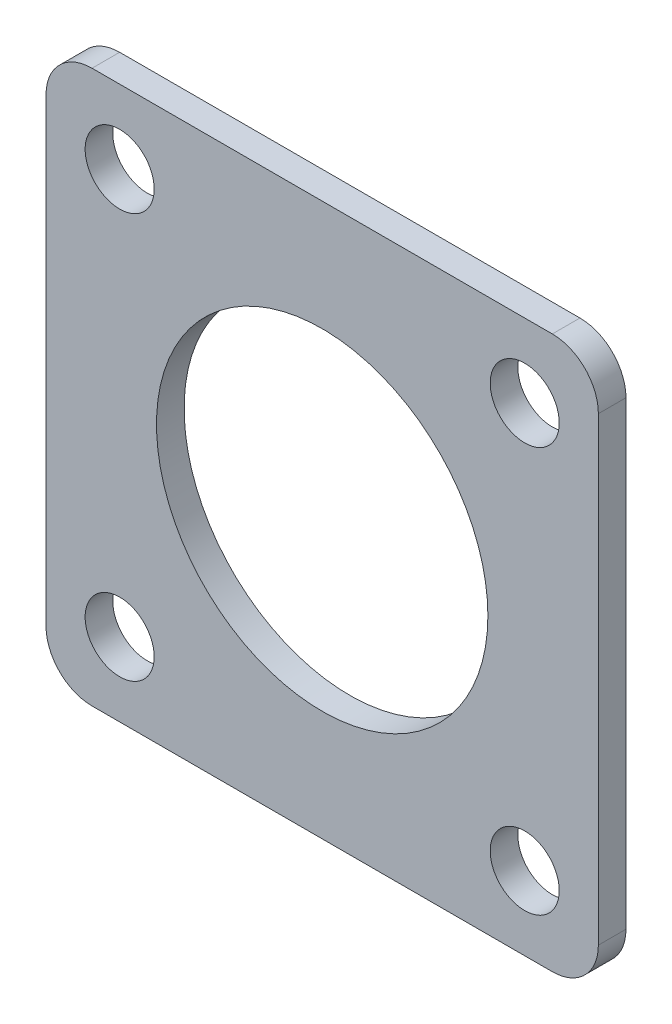
ISO-10303-21;
HEADER;
FILE_DESCRIPTION(('STEP AP214'),'2;1');
FILE_NAME('part.step','',(''),(''),'','','');
FILE_SCHEMA(('AUTOMOTIVE_DESIGN { 1 0 10303 214 1 1 1 1 }'));
ENDSEC;
DATA;
#1=APPLICATION_CONTEXT('core data for automotive mechanical design processes');
#2=APPLICATION_PROTOCOL_DEFINITION('international standard','automotive_design',2000,#1);
#3=PRODUCT_CONTEXT('',#1,'mechanical');
#4=PRODUCT('Part','Part','',(#3));
#5=PRODUCT_RELATED_PRODUCT_CATEGORY('part','',(#4));
#6=PRODUCT_DEFINITION_FORMATION('','',#4);
#7=PRODUCT_DEFINITION_CONTEXT('part definition',#1,'design');
#8=PRODUCT_DEFINITION('design','',#6,#7);
#9=PRODUCT_DEFINITION_SHAPE('','',#8);
#10=(LENGTH_UNIT() NAMED_UNIT(*) SI_UNIT(.MILLI.,.METRE.));
#11=(NAMED_UNIT(*) PLANE_ANGLE_UNIT() SI_UNIT($,.RADIAN.));
#12=(NAMED_UNIT(*) SI_UNIT($,.STERADIAN.) SOLID_ANGLE_UNIT());
#13=UNCERTAINTY_MEASURE_WITH_UNIT(LENGTH_MEASURE(1.E-05),#10,'distance_accuracy_value','');
#14=(GEOMETRIC_REPRESENTATION_CONTEXT(3) GLOBAL_UNCERTAINTY_ASSIGNED_CONTEXT((#13)) GLOBAL_UNIT_ASSIGNED_CONTEXT((#10,
#11,#12)) REPRESENTATION_CONTEXT('',''));
#15=CARTESIAN_POINT('',(0.,0.,0.));
#16=DIRECTION('',(0.,0.,1.));
#17=DIRECTION('',(1.,0.,0.));
#18=AXIS2_PLACEMENT_3D('',#15,#16,#17);
#19=CARTESIAN_POINT('',(0.,0.,0.));
#20=DIRECTION('',(0.,0.,1.));
#21=DIRECTION('',(1.,0.,0.));
#22=AXIS2_PLACEMENT_3D('',#19,#20,#21);
#23=PLANE('',#22);
#24=CARTESIAN_POINT('',(-2.2,2.2,0.));
#25=DIRECTION('',(0.,0.,1.));
#26=DIRECTION('',(1.,0.,0.));
#27=AXIS2_PLACEMENT_3D('',#24,#25,#26);
#28=CIRCLE('',#27,0.375);
#29=CARTESIAN_POINT('',(-1.825,2.2,0.));
#30=VERTEX_POINT('',#29);
#31=EDGE_CURVE('E143',#30,#30,#28,.T.);
#32=ORIENTED_EDGE('',*,*,#31,.T.);
#33=EDGE_LOOP('',(#32));
#34=FACE_BOUND('',#33,.T.);
#35=CARTESIAN_POINT('',(2.2,2.2,0.));
#36=DIRECTION('',(0.,0.,1.));
#37=DIRECTION('',(1.,0.,0.));
#38=AXIS2_PLACEMENT_3D('',#35,#36,#37);
#39=CIRCLE('',#38,0.375);
#40=CARTESIAN_POINT('',(2.575,2.2,0.));
#41=VERTEX_POINT('',#40);
#42=EDGE_CURVE('E146',#41,#41,#39,.T.);
#43=ORIENTED_EDGE('',*,*,#42,.T.);
#44=EDGE_LOOP('',(#43));
#45=FACE_BOUND('',#44,.T.);
#46=CARTESIAN_POINT('',(2.2,-2.2,0.));
#47=DIRECTION('',(0.,0.,1.));
#48=DIRECTION('',(1.,0.,0.));
#49=AXIS2_PLACEMENT_3D('',#46,#47,#48);
#50=CIRCLE('',#49,0.375);
#51=CARTESIAN_POINT('',(2.575,-2.2,0.));
#52=VERTEX_POINT('',#51);
#53=EDGE_CURVE('E149',#52,#52,#50,.T.);
#54=ORIENTED_EDGE('',*,*,#53,.T.);
#55=EDGE_LOOP('',(#54));
#56=FACE_BOUND('',#55,.T.);
#57=CARTESIAN_POINT('',(-2.2,-2.2,0.));
#58=DIRECTION('',(0.,0.,1.));
#59=DIRECTION('',(1.,0.,0.));
#60=AXIS2_PLACEMENT_3D('',#57,#58,#59);
#61=CIRCLE('',#60,0.375);
#62=CARTESIAN_POINT('',(-1.825,-2.2,0.));
#63=VERTEX_POINT('',#62);
#64=EDGE_CURVE('E102',#63,#63,#61,.T.);
#65=ORIENTED_EDGE('',*,*,#64,.T.);
#66=EDGE_LOOP('',(#65));
#67=FACE_BOUND('',#66,.T.);
#68=CARTESIAN_POINT('',(0.,0.,0.));
#69=DIRECTION('',(0.,0.,1.));
#70=DIRECTION('',(1.,0.,0.));
#71=AXIS2_PLACEMENT_3D('',#68,#69,#70);
#72=CIRCLE('',#71,1.8);
#73=CARTESIAN_POINT('',(1.8,0.,0.));
#74=VERTEX_POINT('',#73);
#75=EDGE_CURVE('E99',#74,#74,#72,.T.);
#76=ORIENTED_EDGE('',*,*,#75,.T.);
#77=EDGE_LOOP('',(#76));
#78=FACE_BOUND('',#77,.T.);
#79=DIRECTION('',(0.,1.,0.));
#80=VECTOR('',#79,1.);
#81=CARTESIAN_POINT('',(3.,3.,0.));
#82=LINE('',#81,#80);
#83=CARTESIAN_POINT('',(3.,-2.5,0.));
#84=VERTEX_POINT('',#83);
#85=CARTESIAN_POINT('',(3.,2.5,0.));
#86=VERTEX_POINT('',#85);
#87=EDGE_CURVE('E83',#84,#86,#82,.T.);
#88=ORIENTED_EDGE('',*,*,#87,.F.);
#89=CARTESIAN_POINT('',(2.5,-2.5,0.));
#90=DIRECTION('',(0.,0.,1.));
#91=DIRECTION('',(1.,0.,0.));
#92=AXIS2_PLACEMENT_3D('',#89,#90,#91);
#93=CIRCLE('',#92,0.5);
#94=CARTESIAN_POINT('',(2.5,-3.,0.));
#95=VERTEX_POINT('',#94);
#96=EDGE_CURVE('E96',#95,#84,#93,.T.);
#97=ORIENTED_EDGE('',*,*,#96,.F.);
#98=DIRECTION('',(1.,0.,0.));
#99=VECTOR('',#98,1.);
#100=CARTESIAN_POINT('',(3.,-3.,0.));
#101=LINE('',#100,#99);
#102=CARTESIAN_POINT('',(-2.5,-3.,0.));
#103=VERTEX_POINT('',#102);
#104=EDGE_CURVE('E108',#103,#95,#101,.T.);
#105=ORIENTED_EDGE('',*,*,#104,.F.);
#106=CARTESIAN_POINT('',(-2.5,-2.5,0.));
#107=DIRECTION('',(0.,0.,1.));
#108=DIRECTION('',(1.,0.,0.));
#109=AXIS2_PLACEMENT_3D('',#106,#107,#108);
#110=CIRCLE('',#109,0.5);
#111=CARTESIAN_POINT('',(-3.,-2.5,0.));
#112=VERTEX_POINT('',#111);
#113=EDGE_CURVE('E155',#112,#103,#110,.T.);
#114=ORIENTED_EDGE('',*,*,#113,.F.);
#115=DIRECTION('',(0.,1.,0.));
#116=VECTOR('',#115,1.);
#117=CARTESIAN_POINT('',(-3.,-3.,0.));
#118=LINE('',#117,#116);
#119=CARTESIAN_POINT('',(-3.,2.5,0.));
#120=VERTEX_POINT('',#119);
#121=EDGE_CURVE('E112',#120,#112,#118,.F.);
#122=ORIENTED_EDGE('',*,*,#121,.F.);
#123=CARTESIAN_POINT('',(-2.5,2.5,0.));
#124=DIRECTION('',(0.,0.,1.));
#125=DIRECTION('',(1.,0.,0.));
#126=AXIS2_PLACEMENT_3D('',#123,#124,#125);
#127=CIRCLE('',#126,0.5);
#128=CARTESIAN_POINT('',(-2.5,3.,0.));
#129=VERTEX_POINT('',#128);
#130=EDGE_CURVE('E156',#129,#120,#127,.T.);
#131=ORIENTED_EDGE('',*,*,#130,.F.);
#132=DIRECTION('',(1.,0.,0.));
#133=VECTOR('',#132,1.);
#134=CARTESIAN_POINT('',(-3.,3.,0.));
#135=LINE('',#134,#133);
#136=CARTESIAN_POINT('',(2.5,3.,0.));
#137=VERTEX_POINT('',#136);
#138=EDGE_CURVE('E85',#137,#129,#135,.F.);
#139=ORIENTED_EDGE('',*,*,#138,.F.);
#140=CARTESIAN_POINT('',(2.5,2.5,0.));
#141=DIRECTION('',(0.,0.,1.));
#142=DIRECTION('',(1.,0.,0.));
#143=AXIS2_PLACEMENT_3D('',#140,#141,#142);
#144=CIRCLE('',#143,0.5);
#145=EDGE_CURVE('E20',#86,#137,#144,.T.);
#146=ORIENTED_EDGE('',*,*,#145,.F.);
#147=EDGE_LOOP('',(#88,#97,#105,#114,#122,#131,#139,#146));
#148=FACE_BOUND('',#147,.T.);
#149=ADVANCED_FACE('F17',(#34,#45,#56,#67,#78,#148),#23,.F.);
#150=CARTESIAN_POINT('',(2.5,2.5,0.));
#151=DIRECTION('',(0.,0.,1.));
#152=DIRECTION('',(1.,0.,0.));
#153=AXIS2_PLACEMENT_3D('',#150,#151,#152);
#154=CYLINDRICAL_SURFACE('',#153,0.5);
#155=ORIENTED_EDGE('',*,*,#145,.T.);
#156=DIRECTION('',(0.,0.,1.));
#157=VECTOR('',#156,1.);
#158=CARTESIAN_POINT('',(2.5,3.,0.));
#159=LINE('',#158,#157);
#160=CARTESIAN_POINT('',(2.5,3.,0.3));
#161=VERTEX_POINT('',#160);
#162=EDGE_CURVE('E88',#161,#137,#159,.F.);
#163=ORIENTED_EDGE('',*,*,#162,.F.);
#164=CARTESIAN_POINT('',(2.5,2.5,0.3));
#165=DIRECTION('',(0.,0.,1.));
#166=DIRECTION('',(1.,0.,0.));
#167=AXIS2_PLACEMENT_3D('',#164,#165,#166);
#168=CIRCLE('',#167,0.5);
#169=CARTESIAN_POINT('',(3.,2.5,0.3));
#170=VERTEX_POINT('',#169);
#171=EDGE_CURVE('E93',#170,#161,#168,.T.);
#172=ORIENTED_EDGE('',*,*,#171,.F.);
#173=DIRECTION('',(0.,0.,-1.));
#174=VECTOR('',#173,1.);
#175=CARTESIAN_POINT('',(3.,2.5,0.));
#176=LINE('',#175,#174);
#177=EDGE_CURVE('E90',#86,#170,#176,.F.);
#178=ORIENTED_EDGE('',*,*,#177,.F.);
#179=EDGE_LOOP('',(#155,#163,#172,#178));
#180=FACE_BOUND('',#179,.T.);
#181=ADVANCED_FACE('F91',(#180),#154,.T.);
#182=CARTESIAN_POINT('',(-3.,3.,0.));
#183=DIRECTION('',(0.,1.,0.));
#184=DIRECTION('',(0.,0.,1.));
#185=AXIS2_PLACEMENT_3D('',#182,#183,#184);
#186=PLANE('',#185);
#187=DIRECTION('',(0.,0.,1.));
#188=VECTOR('',#187,1.);
#189=CARTESIAN_POINT('',(-2.5,3.,0.));
#190=LINE('',#189,#188);
#191=CARTESIAN_POINT('',(-2.5,3.,0.3));
#192=VERTEX_POINT('',#191);
#193=EDGE_CURVE('E116',#192,#129,#190,.F.);
#194=ORIENTED_EDGE('',*,*,#193,.F.);
#195=DIRECTION('',(1.,0.,0.));
#196=VECTOR('',#195,1.);
#197=CARTESIAN_POINT('',(0.,3.,0.3));
#198=LINE('',#197,#196);
#199=EDGE_CURVE('E141',#161,#192,#198,.F.);
#200=ORIENTED_EDGE('',*,*,#199,.F.);
#201=ORIENTED_EDGE('',*,*,#162,.T.);
#202=ORIENTED_EDGE('',*,*,#138,.T.);
#203=EDGE_LOOP('',(#194,#200,#201,#202));
#204=FACE_BOUND('',#203,.T.);
#205=ADVANCED_FACE('F193',(#204),#186,.T.);
#206=CARTESIAN_POINT('',(-2.5,2.5,0.));
#207=DIRECTION('',(0.,0.,1.));
#208=DIRECTION('',(1.,0.,0.));
#209=AXIS2_PLACEMENT_3D('',#206,#207,#208);
#210=CYLINDRICAL_SURFACE('',#209,0.5);
#211=ORIENTED_EDGE('',*,*,#130,.T.);
#212=DIRECTION('',(0.,0.,1.));
#213=VECTOR('',#212,1.);
#214=CARTESIAN_POINT('',(-3.,2.5,0.));
#215=LINE('',#214,#213);
#216=CARTESIAN_POINT('',(-3.,2.5,0.3));
#217=VERTEX_POINT('',#216);
#218=EDGE_CURVE('E115',#217,#120,#215,.F.);
#219=ORIENTED_EDGE('',*,*,#218,.F.);
#220=CARTESIAN_POINT('',(-2.5,2.5,0.3));
#221=DIRECTION('',(0.,0.,1.));
#222=DIRECTION('',(1.,0.,0.));
#223=AXIS2_PLACEMENT_3D('',#220,#221,#222);
#224=CIRCLE('',#223,0.5);
#225=EDGE_CURVE('E138',#192,#217,#224,.T.);
#226=ORIENTED_EDGE('',*,*,#225,.F.);
#227=ORIENTED_EDGE('',*,*,#193,.T.);
#228=EDGE_LOOP('',(#211,#219,#226,#227));
#229=FACE_BOUND('',#228,.T.);
#230=ADVANCED_FACE('F190',(#229),#210,.T.);
#231=CARTESIAN_POINT('',(-3.,-3.,0.));
#232=DIRECTION('',(-1.,0.,0.));
#233=DIRECTION('',(0.,0.,1.));
#234=AXIS2_PLACEMENT_3D('',#231,#232,#233);
#235=PLANE('',#234);
#236=DIRECTION('',(0.,0.,1.));
#237=VECTOR('',#236,1.);
#238=CARTESIAN_POINT('',(-3.,-2.5,0.));
#239=LINE('',#238,#237);
#240=CARTESIAN_POINT('',(-3.,-2.5,0.3));
#241=VERTEX_POINT('',#240);
#242=EDGE_CURVE('E114',#241,#112,#239,.F.);
#243=ORIENTED_EDGE('',*,*,#242,.F.);
#244=DIRECTION('',(0.,1.,0.));
#245=VECTOR('',#244,1.);
#246=CARTESIAN_POINT('',(-3.,0.,0.3));
#247=LINE('',#246,#245);
#248=EDGE_CURVE('E137',#217,#241,#247,.F.);
#249=ORIENTED_EDGE('',*,*,#248,.F.);
#250=ORIENTED_EDGE('',*,*,#218,.T.);
#251=ORIENTED_EDGE('',*,*,#121,.T.);
#252=EDGE_LOOP('',(#243,#249,#250,#251));
#253=FACE_BOUND('',#252,.T.);
#254=ADVANCED_FACE('F189',(#253),#235,.T.);
#255=CARTESIAN_POINT('',(-2.5,-2.5,0.));
#256=DIRECTION('',(0.,0.,1.));
#257=DIRECTION('',(1.,0.,0.));
#258=AXIS2_PLACEMENT_3D('',#255,#256,#257);
#259=CYLINDRICAL_SURFACE('',#258,0.5);
#260=ORIENTED_EDGE('',*,*,#113,.T.);
#261=DIRECTION('',(0.,0.,-1.));
#262=VECTOR('',#261,1.);
#263=CARTESIAN_POINT('',(-2.5,-3.,0.));
#264=LINE('',#263,#262);
#265=CARTESIAN_POINT('',(-2.5,-3.,0.3));
#266=VERTEX_POINT('',#265);
#267=EDGE_CURVE('E111',#266,#103,#264,.T.);
#268=ORIENTED_EDGE('',*,*,#267,.F.);
#269=CARTESIAN_POINT('',(-2.5,-2.5,0.3));
#270=DIRECTION('',(0.,0.,1.));
#271=DIRECTION('',(1.,0.,0.));
#272=AXIS2_PLACEMENT_3D('',#269,#270,#271);
#273=CIRCLE('',#272,0.5);
#274=EDGE_CURVE('E134',#241,#266,#273,.T.);
#275=ORIENTED_EDGE('',*,*,#274,.F.);
#276=ORIENTED_EDGE('',*,*,#242,.T.);
#277=EDGE_LOOP('',(#260,#268,#275,#276));
#278=FACE_BOUND('',#277,.T.);
#279=ADVANCED_FACE('F186',(#278),#259,.T.);
#280=CARTESIAN_POINT('',(3.,-3.,0.));
#281=DIRECTION('',(0.,-1.,0.));
#282=DIRECTION('',(0.,0.,-1.));
#283=AXIS2_PLACEMENT_3D('',#280,#281,#282);
#284=PLANE('',#283);
#285=ORIENTED_EDGE('',*,*,#267,.T.);
#286=ORIENTED_EDGE('',*,*,#104,.T.);
#287=DIRECTION('',(0.,0.,1.));
#288=VECTOR('',#287,1.);
#289=CARTESIAN_POINT('',(2.5,-3.,0.));
#290=LINE('',#289,#288);
#291=CARTESIAN_POINT('',(2.5,-3.,0.3));
#292=VERTEX_POINT('',#291);
#293=EDGE_CURVE('E110',#292,#95,#290,.F.);
#294=ORIENTED_EDGE('',*,*,#293,.F.);
#295=DIRECTION('',(1.,0.,0.));
#296=VECTOR('',#295,1.);
#297=CARTESIAN_POINT('',(0.,-3.,0.3));
#298=LINE('',#297,#296);
#299=EDGE_CURVE('E133',#266,#292,#298,.T.);
#300=ORIENTED_EDGE('',*,*,#299,.F.);
#301=EDGE_LOOP('',(#285,#286,#294,#300));
#302=FACE_BOUND('',#301,.T.);
#303=ADVANCED_FACE('F181',(#302),#284,.T.);
#304=CARTESIAN_POINT('',(2.5,-2.5,0.));
#305=DIRECTION('',(0.,0.,1.));
#306=DIRECTION('',(1.,0.,0.));
#307=AXIS2_PLACEMENT_3D('',#304,#305,#306);
#308=CYLINDRICAL_SURFACE('',#307,0.5);
#309=ORIENTED_EDGE('',*,*,#96,.T.);
#310=DIRECTION('',(0.,0.,-1.));
#311=VECTOR('',#310,1.);
#312=CARTESIAN_POINT('',(3.,-2.5,0.));
#313=LINE('',#312,#311);
#314=CARTESIAN_POINT('',(3.,-2.5,0.3));
#315=VERTEX_POINT('',#314);
#316=EDGE_CURVE('E35',#315,#84,#313,.T.);
#317=ORIENTED_EDGE('',*,*,#316,.F.);
#318=CARTESIAN_POINT('',(2.5,-2.5,0.3));
#319=DIRECTION('',(0.,0.,1.));
#320=DIRECTION('',(1.,0.,0.));
#321=AXIS2_PLACEMENT_3D('',#318,#319,#320);
#322=CIRCLE('',#321,0.5);
#323=EDGE_CURVE('E130',#292,#315,#322,.T.);
#324=ORIENTED_EDGE('',*,*,#323,.F.);
#325=ORIENTED_EDGE('',*,*,#293,.T.);
#326=EDGE_LOOP('',(#309,#317,#324,#325));
#327=FACE_BOUND('',#326,.T.);
#328=ADVANCED_FACE('F179',(#327),#308,.T.);
#329=CARTESIAN_POINT('',(3.,3.,0.));
#330=DIRECTION('',(1.,0.,0.));
#331=DIRECTION('',(0.,0.,-1.));
#332=AXIS2_PLACEMENT_3D('',#329,#330,#331);
#333=PLANE('',#332);
#334=ORIENTED_EDGE('',*,*,#316,.T.);
#335=ORIENTED_EDGE('',*,*,#87,.T.);
#336=ORIENTED_EDGE('',*,*,#177,.T.);
#337=DIRECTION('',(0.,1.,0.));
#338=VECTOR('',#337,1.);
#339=CARTESIAN_POINT('',(3.,0.,0.3));
#340=LINE('',#339,#338);
#341=EDGE_CURVE('E129',#315,#170,#340,.T.);
#342=ORIENTED_EDGE('',*,*,#341,.F.);
#343=EDGE_LOOP('',(#334,#335,#336,#342));
#344=FACE_BOUND('',#343,.T.);
#345=ADVANCED_FACE('F98',(#344),#333,.T.);
#346=CARTESIAN_POINT('',(0.,0.,0.));
#347=DIRECTION('',(0.,0.,1.));
#348=DIRECTION('',(1.,0.,0.));
#349=AXIS2_PLACEMENT_3D('',#346,#347,#348);
#350=CYLINDRICAL_SURFACE('',#349,1.8);
#351=ORIENTED_EDGE('',*,*,#75,.F.);
#352=EDGE_LOOP('',(#351));
#353=FACE_BOUND('',#352,.T.);
#354=CARTESIAN_POINT('',(0.,0.,0.3));
#355=DIRECTION('',(0.,0.,1.));
#356=DIRECTION('',(1.,0.,0.));
#357=AXIS2_PLACEMENT_3D('',#354,#355,#356);
#358=CIRCLE('',#357,1.8);
#359=CARTESIAN_POINT('',(1.8,0.,0.3));
#360=VERTEX_POINT('',#359);
#361=EDGE_CURVE('E126',#360,#360,#358,.F.);
#362=ORIENTED_EDGE('',*,*,#361,.F.);
#363=EDGE_LOOP('',(#362));
#364=FACE_BOUND('',#363,.T.);
#365=ADVANCED_FACE('F224',(#353,#364),#350,.F.);
#366=CARTESIAN_POINT('',(-2.2,-2.2,0.));
#367=DIRECTION('',(0.,0.,1.));
#368=DIRECTION('',(1.,0.,0.));
#369=AXIS2_PLACEMENT_3D('',#366,#367,#368);
#370=CYLINDRICAL_SURFACE('',#369,0.375);
#371=ORIENTED_EDGE('',*,*,#64,.F.);
#372=EDGE_LOOP('',(#371));
#373=FACE_BOUND('',#372,.T.);
#374=CARTESIAN_POINT('',(-2.2,-2.2,0.3));
#375=DIRECTION('',(0.,0.,1.));
#376=DIRECTION('',(1.,0.,0.));
#377=AXIS2_PLACEMENT_3D('',#374,#375,#376);
#378=CIRCLE('',#377,0.375);
#379=CARTESIAN_POINT('',(-1.825,-2.2,0.3));
#380=VERTEX_POINT('',#379);
#381=EDGE_CURVE('E123',#380,#380,#378,.F.);
#382=ORIENTED_EDGE('',*,*,#381,.F.);
#383=EDGE_LOOP('',(#382));
#384=FACE_BOUND('',#383,.T.);
#385=ADVANCED_FACE('F220',(#373,#384),#370,.F.);
#386=CARTESIAN_POINT('',(2.2,-2.2,0.));
#387=DIRECTION('',(0.,0.,1.));
#388=DIRECTION('',(1.,0.,0.));
#389=AXIS2_PLACEMENT_3D('',#386,#387,#388);
#390=CYLINDRICAL_SURFACE('',#389,0.375);
#391=ORIENTED_EDGE('',*,*,#53,.F.);
#392=EDGE_LOOP('',(#391));
#393=FACE_BOUND('',#392,.T.);
#394=CARTESIAN_POINT('',(2.2,-2.2,0.3));
#395=DIRECTION('',(0.,0.,1.));
#396=DIRECTION('',(1.,0.,0.));
#397=AXIS2_PLACEMENT_3D('',#394,#395,#396);
#398=CIRCLE('',#397,0.375);
#399=CARTESIAN_POINT('',(2.575,-2.2,0.3));
#400=VERTEX_POINT('',#399);
#401=EDGE_CURVE('E120',#400,#400,#398,.F.);
#402=ORIENTED_EDGE('',*,*,#401,.F.);
#403=EDGE_LOOP('',(#402));
#404=FACE_BOUND('',#403,.T.);
#405=ADVANCED_FACE('F216',(#393,#404),#390,.F.);
#406=CARTESIAN_POINT('',(2.2,2.2,0.));
#407=DIRECTION('',(0.,0.,1.));
#408=DIRECTION('',(1.,0.,0.));
#409=AXIS2_PLACEMENT_3D('',#406,#407,#408);
#410=CYLINDRICAL_SURFACE('',#409,0.375);
#411=ORIENTED_EDGE('',*,*,#42,.F.);
#412=EDGE_LOOP('',(#411));
#413=FACE_BOUND('',#412,.T.);
#414=CARTESIAN_POINT('',(2.2,2.2,0.3));
#415=DIRECTION('',(0.,0.,1.));
#416=DIRECTION('',(1.,0.,0.));
#417=AXIS2_PLACEMENT_3D('',#414,#415,#416);
#418=CIRCLE('',#417,0.375);
#419=CARTESIAN_POINT('',(2.575,2.2,0.3));
#420=VERTEX_POINT('',#419);
#421=EDGE_CURVE('E26',#420,#420,#418,.F.);
#422=ORIENTED_EDGE('',*,*,#421,.F.);
#423=EDGE_LOOP('',(#422));
#424=FACE_BOUND('',#423,.T.);
#425=ADVANCED_FACE('F209',(#413,#424),#410,.F.);
#426=CARTESIAN_POINT('',(-2.2,2.2,0.));
#427=DIRECTION('',(0.,0.,1.));
#428=DIRECTION('',(1.,0.,0.));
#429=AXIS2_PLACEMENT_3D('',#426,#427,#428);
#430=CYLINDRICAL_SURFACE('',#429,0.375);
#431=ORIENTED_EDGE('',*,*,#31,.F.);
#432=EDGE_LOOP('',(#431));
#433=FACE_BOUND('',#432,.T.);
#434=CARTESIAN_POINT('',(-2.2,2.2,0.3));
#435=DIRECTION('',(0.,0.,1.));
#436=DIRECTION('',(1.,0.,0.));
#437=AXIS2_PLACEMENT_3D('',#434,#435,#436);
#438=CIRCLE('',#437,0.375);
#439=CARTESIAN_POINT('',(-1.825,2.2,0.3));
#440=VERTEX_POINT('',#439);
#441=EDGE_CURVE('E11',#440,#440,#438,.F.);
#442=ORIENTED_EDGE('',*,*,#441,.F.);
#443=EDGE_LOOP('',(#442));
#444=FACE_BOUND('',#443,.T.);
#445=ADVANCED_FACE('F203',(#433,#444),#430,.F.);
#446=CARTESIAN_POINT('',(0.,0.,0.3));
#447=DIRECTION('',(0.,0.,1.));
#448=DIRECTION('',(1.,0.,0.));
#449=AXIS2_PLACEMENT_3D('',#446,#447,#448);
#450=PLANE('',#449);
#451=ORIENTED_EDGE('',*,*,#441,.T.);
#452=EDGE_LOOP('',(#451));
#453=FACE_BOUND('',#452,.T.);
#454=ORIENTED_EDGE('',*,*,#421,.T.);
#455=EDGE_LOOP('',(#454));
#456=FACE_BOUND('',#455,.T.);
#457=ORIENTED_EDGE('',*,*,#401,.T.);
#458=EDGE_LOOP('',(#457));
#459=FACE_BOUND('',#458,.T.);
#460=ORIENTED_EDGE('',*,*,#381,.T.);
#461=EDGE_LOOP('',(#460));
#462=FACE_BOUND('',#461,.T.);
#463=ORIENTED_EDGE('',*,*,#361,.T.);
#464=EDGE_LOOP('',(#463));
#465=FACE_BOUND('',#464,.T.);
#466=ORIENTED_EDGE('',*,*,#323,.T.);
#467=ORIENTED_EDGE('',*,*,#341,.T.);
#468=ORIENTED_EDGE('',*,*,#171,.T.);
#469=ORIENTED_EDGE('',*,*,#199,.T.);
#470=ORIENTED_EDGE('',*,*,#225,.T.);
#471=ORIENTED_EDGE('',*,*,#248,.T.);
#472=ORIENTED_EDGE('',*,*,#274,.T.);
#473=ORIENTED_EDGE('',*,*,#299,.T.);
#474=EDGE_LOOP('',(#466,#467,#468,#469,#470,#471,#472,#473));
#475=FACE_BOUND('',#474,.T.);
#476=ADVANCED_FACE('F177',(#453,#456,#459,#462,#465,#475),#450,.T.);
#477=CLOSED_SHELL('',(#149,#181,#205,#230,#254,#279,#303,#328,#345,#365,#385,#405,#425,#445,#476));
#478=MANIFOLD_SOLID_BREP('B1',#477);
#479=ADVANCED_BREP_SHAPE_REPRESENTATION('',(#18,#478),#14);
#480=SHAPE_DEFINITION_REPRESENTATION(#9,#479);
ENDSEC;
END-ISO-10303-21;
